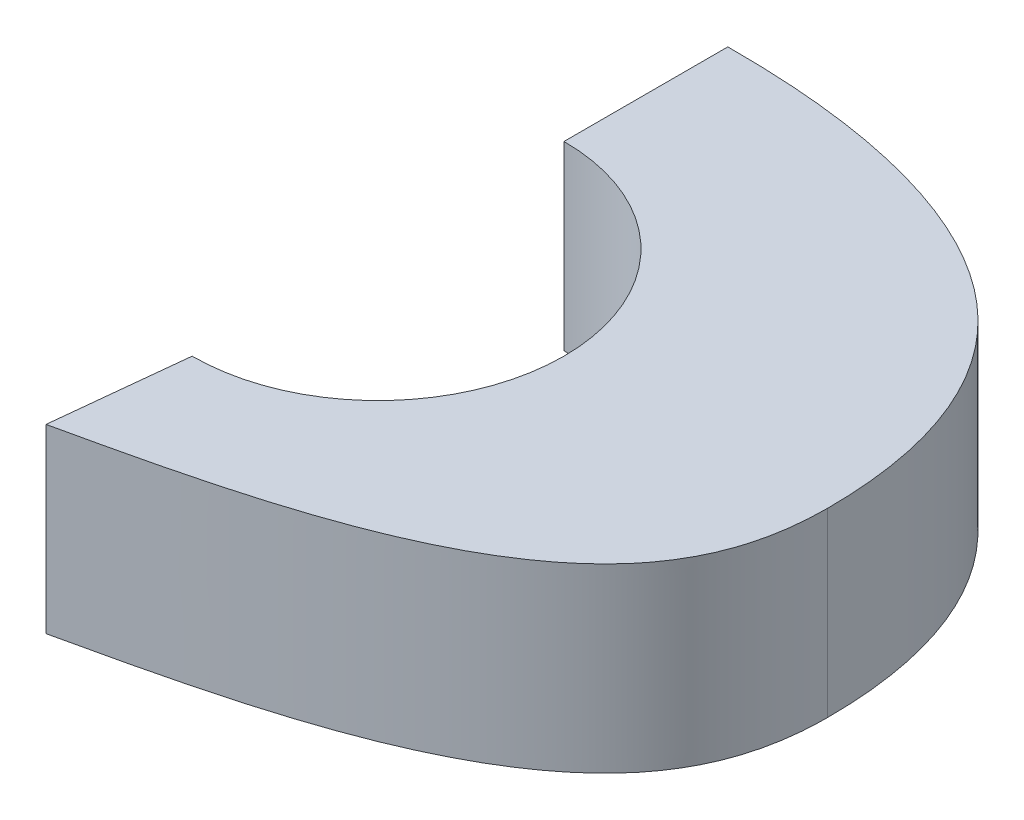
ISO-10303-21;
HEADER;
FILE_DESCRIPTION(('STEP AP214'),'2;1');
FILE_NAME('part.step','',(''),(''),'','','');
FILE_SCHEMA(('AUTOMOTIVE_DESIGN { 1 0 10303 214 1 1 1 1 }'));
ENDSEC;
DATA;
#1=APPLICATION_CONTEXT('core data for automotive mechanical design processes');
#2=APPLICATION_PROTOCOL_DEFINITION('international standard','automotive_design',2000,#1);
#3=PRODUCT_CONTEXT('',#1,'mechanical');
#4=PRODUCT('Part','Part','',(#3));
#5=PRODUCT_RELATED_PRODUCT_CATEGORY('part','',(#4));
#6=PRODUCT_DEFINITION_FORMATION('','',#4);
#7=PRODUCT_DEFINITION_CONTEXT('part definition',#1,'design');
#8=PRODUCT_DEFINITION('design','',#6,#7);
#9=PRODUCT_DEFINITION_SHAPE('','',#8);
#10=(LENGTH_UNIT() NAMED_UNIT(*) SI_UNIT(.MILLI.,.METRE.));
#11=(NAMED_UNIT(*) PLANE_ANGLE_UNIT() SI_UNIT($,.RADIAN.));
#12=(NAMED_UNIT(*) SI_UNIT($,.STERADIAN.) SOLID_ANGLE_UNIT());
#13=UNCERTAINTY_MEASURE_WITH_UNIT(LENGTH_MEASURE(1.E-05),#10,'distance_accuracy_value','');
#14=(GEOMETRIC_REPRESENTATION_CONTEXT(3) GLOBAL_UNCERTAINTY_ASSIGNED_CONTEXT((#13)) GLOBAL_UNIT_ASSIGNED_CONTEXT((#10,
#11,#12)) REPRESENTATION_CONTEXT('',''));
#15=CARTESIAN_POINT('',(0.,0.,0.));
#16=DIRECTION('',(0.,0.,1.));
#17=DIRECTION('',(1.,0.,0.));
#18=AXIS2_PLACEMENT_3D('',#15,#16,#17);
#19=CARTESIAN_POINT('',(-54.0363656247546,0.,-30.75));
#20=DIRECTION('',(0.,1.,0.));
#21=DIRECTION('',(0.,0.,1.));
#22=AXIS2_PLACEMENT_3D('',#19,#20,#21);
#23=PLANE('',#22);
#24=DIRECTION('',(-0.105174760256228,0.,0.994453754482854));
#25=VECTOR('',#24,1.);
#26=CARTESIAN_POINT('',(3.69141825415091,0.,-24.6446323021882));
#27=LINE('',#26,#25);
#28=CARTESIAN_POINT('',(0.,0.,10.258653745374));
#29=VERTEX_POINT('',#28);
#30=CARTESIAN_POINT('',(-0.771119946908726,0.,17.5497863754062));
#31=VERTEX_POINT('',#30);
#32=EDGE_CURVE('E117',#29,#31,#27,.T.);
#33=ORIENTED_EDGE('',*,*,#32,.F.);
#34=CARTESIAN_POINT('',(0.,0.,0.));
#35=DIRECTION('',(0.,1.,0.));
#36=DIRECTION('',(0.,0.,1.));
#37=AXIS2_PLACEMENT_3D('',#34,#35,#36);
#38=CIRCLE('',#37,10.258653745374);
#39=CARTESIAN_POINT('',(0.,0.,-10.258653745374));
#40=VERTEX_POINT('',#39);
#41=EDGE_CURVE('E86',#40,#29,#38,.F.);
#42=ORIENTED_EDGE('',*,*,#41,.F.);
#43=DIRECTION('',(0.,0.,1.));
#44=VECTOR('',#43,1.);
#45=CARTESIAN_POINT('',(0.,0.,-30.75));
#46=LINE('',#45,#44);
#47=CARTESIAN_POINT('',(0.,0.,-19.3));
#48=VERTEX_POINT('',#47);
#49=EDGE_CURVE('E89',#48,#40,#46,.T.);
#50=ORIENTED_EDGE('',*,*,#49,.F.);
#51=CARTESIAN_POINT('',(24.8,0.,0.));
#52=CARTESIAN_POINT('',(24.8000015744337,0.,-1.49979452721091));
#53=CARTESIAN_POINT('',(24.6798675826929,0.,-2.97831562820964));
#54=CARTESIAN_POINT('',(24.2702622382681,0.,-5.15547469962744));
#55=CARTESIAN_POINT('',(24.0952050293792,0.,-5.87437295534883));
#56=CARTESIAN_POINT('',(23.7647852909253,0.,-6.94070840901966));
#57=CARTESIAN_POINT('',(23.6433054797848,0.,-7.29414550802442));
#58=CARTESIAN_POINT('',(23.3754912884338,0.,-7.99661849615101));
#59=CARTESIAN_POINT('',(23.2292080007831,0.,-8.3451272181344));
#60=CARTESIAN_POINT('',(22.7584353220897,0.,-9.36583810657752));
#61=CARTESIAN_POINT('',(22.3999317471622,0.,-10.0190317447576));
#62=CARTESIAN_POINT('',(21.5892426749382,0.,-11.2681877421538));
#63=CARTESIAN_POINT('',(21.1362438818968,0.,-11.8650387848125));
#64=CARTESIAN_POINT('',(19.6346830602268,0.,-13.5599686321418));
#65=CARTESIAN_POINT('',(18.4892029152586,0.,-14.5136863066977));
#66=CARTESIAN_POINT('',(16.9096804013256,0.,-15.5256534747403));
#67=CARTESIAN_POINT('',(16.5853525897709,0.,-15.7195004166465));
#68=CARTESIAN_POINT('',(15.9298223171448,0.,-16.0859387820694));
#69=CARTESIAN_POINT('',(15.598164332097,0.,-16.2589123530397));
#70=CARTESIAN_POINT('',(14.5925785934927,0.,-16.7499038499375));
#71=CARTESIAN_POINT('',(13.9080815118995,0.,-17.0401042985345));
#72=CARTESIAN_POINT('',(12.5152933535608,0.,-17.557881638352));
#73=CARTESIAN_POINT('',(11.80698587176,0.,-17.7854153530101));
#74=CARTESIAN_POINT('',(10.3697828105273,0.,-18.1862968457047));
#75=CARTESIAN_POINT('',(9.63866147903293,0.,-18.36002568154));
#76=CARTESIAN_POINT('',(7.43663360861958,0.,-18.8060098118951));
#77=CARTESIAN_POINT('',(5.95900169711121,0.,-19.0044890875771));
#78=CARTESIAN_POINT('',(2.98950104966866,0.,-19.255065785839));
#79=CARTESIAN_POINT('',(1.49753200090117,0.,-19.3061318001508));
#80=CARTESIAN_POINT('',(0.,0.,-19.3));
#81=B_SPLINE_CURVE_WITH_KNOTS('',3,(#51,#52,#53,#54,#55,#56,#57,#58,#59,#60,#61,#62,#63,#64,#65,
#66,#67,#68,#69,#70,#71,#72,#73,#74,#75,#76,#77,#78,#79,#80),.UNSPECIFIED.,.F.,.F.,(4,2,2,2,2,2,
2,2,2,2,2,2,2,2,4),(0.,0.124999999999999,0.187499999999999,0.218749999999999,0.249999999999999,
0.312499999999999,0.374999999999999,0.5,0.53125,0.5625,0.625,0.6875,0.75,0.875,1.),.UNSPECIFIED.);
#82=CARTESIAN_POINT('',(24.8,0.,0.));
#83=VERTEX_POINT('',#82);
#84=EDGE_CURVE('E175',#83,#48,#81,.T.);
#85=ORIENTED_EDGE('',*,*,#84,.F.);
#86=CARTESIAN_POINT('',(-0.771119946908726,0.,17.5497863754062));
#87=CARTESIAN_POINT('',(1.96332113946662,0.,16.9454486099031));
#88=CARTESIAN_POINT('',(4.6953411490743,0.,16.3335757900358));
#89=CARTESIAN_POINT('',(8.7300249024378,0.,15.2186156366684));
#90=CARTESIAN_POINT('',(10.064478194636,0.,14.8144660894164));
#91=CARTESIAN_POINT('',(12.6997298231446,0.,13.9014235495045));
#92=CARTESIAN_POINT('',(14.0007960074535,0.,13.3933641732161));
#93=CARTESIAN_POINT('',(15.9118882822926,0.,12.5052062193334));
#94=CARTESIAN_POINT('',(16.5420918653368,0.,12.1879055278116));
#95=CARTESIAN_POINT('',(17.7844021533336,0.,11.4969817009426));
#96=CARTESIAN_POINT('',(18.3919176974607,0.,11.1256625764923));
#97=CARTESIAN_POINT('',(19.5594101743914,0.,10.3246328599442));
#98=CARTESIAN_POINT('',(20.1211643421252,0.,9.89409815050034));
#99=CARTESIAN_POINT('',(20.9205386125971,0.,9.18924898015773));
#100=CARTESIAN_POINT('',(21.1806829109853,0.,8.94339318598233));
#101=CARTESIAN_POINT('',(21.6784621530258,0.,8.43466062188636));
#102=CARTESIAN_POINT('',(21.9161353542625,0.,8.17190790439401));
#103=CARTESIAN_POINT('',(22.5925909797541,0.,7.35631113149856));
#104=CARTESIAN_POINT('',(22.9947459940547,0.,6.77608102822973));
#105=CARTESIAN_POINT('',(23.5131230455677,0.,5.84229005599218));
#106=CARTESIAN_POINT('',(23.6718222440997,0.,5.51977932742099));
#107=CARTESIAN_POINT('',(23.9535662982575,0.,4.86813842037827));
#108=CARTESIAN_POINT('',(24.0776882219069,0.,4.53727326165061));
#109=CARTESIAN_POINT('',(24.402854636612,0.,3.53046253962296));
#110=CARTESIAN_POINT('',(24.5567458779073,0.,2.84031561657847));
#111=CARTESIAN_POINT('',(24.7559506331205,0.,1.42732092008006));
#112=CARTESIAN_POINT('',(24.8,0.,0.714331591055543));
#113=CARTESIAN_POINT('',(24.8,0.,0.));
#114=B_SPLINE_CURVE_WITH_KNOTS('',3,(#86,#87,#88,#89,#90,#91,#92,#93,#94,#95,#96,#97,#98,#99,
#100,#101,#102,#103,#104,#105,#106,#107,#108,#109,#110,#111,#112,#113),.UNSPECIFIED.,.F.,.F.,(4,
2,2,2,2,2,2,2,2,2,2,2,2,4),(0.,0.25,0.375,0.499999999999999,0.562499999999999,0.624999999999999,
0.687499999999999,0.718749999999999,0.749999999999999,0.812499999999999,0.843749999999999,
0.874999999999999,0.9375,1.),.UNSPECIFIED.);
#115=EDGE_CURVE('E164',#31,#83,#114,.T.);
#116=ORIENTED_EDGE('',*,*,#115,.F.);
#117=EDGE_LOOP('',(#33,#42,#50,#85,#116));
#118=FACE_BOUND('',#117,.T.);
#119=ADVANCED_FACE('F33',(#118),#23,.F.);
#120=CARTESIAN_POINT('',(-54.0363656247546,10.,-30.75));
#121=DIRECTION('',(0.,1.,0.));
#122=DIRECTION('',(0.,0.,1.));
#123=AXIS2_PLACEMENT_3D('',#120,#121,#122);
#124=PLANE('',#123);
#125=CARTESIAN_POINT('',(0.,10.,0.));
#126=DIRECTION('',(0.,-1.,0.));
#127=DIRECTION('',(0.,0.,-1.));
#128=AXIS2_PLACEMENT_3D('',#125,#126,#127);
#129=CIRCLE('',#128,10.258653745374);
#130=CARTESIAN_POINT('',(0.,10.,-10.258653745374));
#131=VERTEX_POINT('',#130);
#132=CARTESIAN_POINT('',(0.,10.,10.258653745374));
#133=VERTEX_POINT('',#132);
#134=EDGE_CURVE('E51',#131,#133,#129,.T.);
#135=ORIENTED_EDGE('',*,*,#134,.T.);
#136=DIRECTION('',(-0.105174760256228,0.,0.994453754482854));
#137=VECTOR('',#136,1.);
#138=CARTESIAN_POINT('',(0.,10.,10.258653745374));
#139=LINE('',#138,#137);
#140=CARTESIAN_POINT('',(-0.771119946908726,10.,17.5497863754062));
#141=VERTEX_POINT('',#140);
#142=EDGE_CURVE('E93',#133,#141,#139,.T.);
#143=ORIENTED_EDGE('',*,*,#142,.T.);
#144=CARTESIAN_POINT('',(24.8,10.,0.));
#145=CARTESIAN_POINT('',(24.8,10.,0.714331591055543));
#146=CARTESIAN_POINT('',(24.7559506331205,10.,1.42732092008006));
#147=CARTESIAN_POINT('',(24.5567458779073,10.,2.84031561657847));
#148=CARTESIAN_POINT('',(24.402854636612,10.,3.53046253962296));
#149=CARTESIAN_POINT('',(24.0776882219069,10.,4.53727326165061));
#150=CARTESIAN_POINT('',(23.9535662982575,10.,4.86813842037827));
#151=CARTESIAN_POINT('',(23.6718222440997,10.,5.51977932742099));
#152=CARTESIAN_POINT('',(23.5131230455677,10.,5.84229005599218));
#153=CARTESIAN_POINT('',(22.9947459940547,10.,6.77608102822973));
#154=CARTESIAN_POINT('',(22.5925909797541,10.,7.35631113149856));
#155=CARTESIAN_POINT('',(21.9161353542625,10.,8.17190790439401));
#156=CARTESIAN_POINT('',(21.6784621530258,10.,8.43466062188636));
#157=CARTESIAN_POINT('',(21.1806829109853,10.,8.94339318598233));
#158=CARTESIAN_POINT('',(20.9205386125971,10.,9.18924898015773));
#159=CARTESIAN_POINT('',(20.1211643421252,10.,9.89409815050034));
#160=CARTESIAN_POINT('',(19.5594101743914,10.,10.3246328599442));
#161=CARTESIAN_POINT('',(18.3919176974607,10.,11.1256625764923));
#162=CARTESIAN_POINT('',(17.7844021533336,10.,11.4969817009426));
#163=CARTESIAN_POINT('',(16.5420918653368,10.,12.1879055278116));
#164=CARTESIAN_POINT('',(15.9118882822926,10.,12.5052062193334));
#165=CARTESIAN_POINT('',(14.0007960074535,10.,13.3933641732161));
#166=CARTESIAN_POINT('',(12.6997298231446,10.,13.9014235495045));
#167=CARTESIAN_POINT('',(10.064478194636,10.,14.8144660894164));
#168=CARTESIAN_POINT('',(8.7300249024378,10.,15.2186156366684));
#169=CARTESIAN_POINT('',(4.6953411490743,10.,16.3335757900358));
#170=CARTESIAN_POINT('',(1.96332113946662,10.,16.9454486099031));
#171=CARTESIAN_POINT('',(-0.771119946908726,10.,17.5497863754062));
#172=B_SPLINE_CURVE_WITH_KNOTS('',3,(#144,#145,#146,#147,#148,#149,#150,#151,#152,#153,#154,
#155,#156,#157,#158,#159,#160,#161,#162,#163,#164,#165,#166,#167,#168,#169,#170,#171),
.UNSPECIFIED.,.F.,.F.,(4,2,2,2,2,2,2,2,2,2,2,2,2,4),(0.,0.0625000000000003,0.125000000000001,
0.156250000000001,0.187500000000001,0.250000000000001,0.281250000000001,0.312500000000001,
0.375000000000001,0.437500000000001,0.500000000000001,0.625,0.75,1.),.UNSPECIFIED.);
#173=CARTESIAN_POINT('',(24.8,10.,0.));
#174=VERTEX_POINT('',#173);
#175=EDGE_CURVE('E119',#141,#174,#172,.F.);
#176=ORIENTED_EDGE('',*,*,#175,.T.);
#177=CARTESIAN_POINT('',(0.,10.,-19.3));
#178=CARTESIAN_POINT('',(1.49753200090117,10.,-19.3061318001508));
#179=CARTESIAN_POINT('',(2.98950104966866,10.,-19.255065785839));
#180=CARTESIAN_POINT('',(5.95900169711121,10.,-19.0044890875771));
#181=CARTESIAN_POINT('',(7.43663360861958,10.,-18.8060098118951));
#182=CARTESIAN_POINT('',(9.63866147903293,10.,-18.36002568154));
#183=CARTESIAN_POINT('',(10.3697828105273,10.,-18.1862968457047));
#184=CARTESIAN_POINT('',(11.80698587176,10.,-17.7854153530101));
#185=CARTESIAN_POINT('',(12.5152933535608,10.,-17.557881638352));
#186=CARTESIAN_POINT('',(13.9080815118995,10.,-17.0401042985345));
#187=CARTESIAN_POINT('',(14.5925785934927,10.,-16.7499038499375));
#188=CARTESIAN_POINT('',(15.598164332097,10.,-16.2589123530397));
#189=CARTESIAN_POINT('',(15.9298223171448,10.,-16.0859387820694));
#190=CARTESIAN_POINT('',(16.5853525897709,10.,-15.7195004166465));
#191=CARTESIAN_POINT('',(16.9096804013256,10.,-15.5256534747403));
#192=CARTESIAN_POINT('',(18.4892029152586,10.,-14.5136863066977));
#193=CARTESIAN_POINT('',(19.6346830602268,10.,-13.5599686321418));
#194=CARTESIAN_POINT('',(21.1362438818968,10.,-11.8650387848125));
#195=CARTESIAN_POINT('',(21.5892426749382,10.,-11.2681877421538));
#196=CARTESIAN_POINT('',(22.3999317471622,10.,-10.0190317447576));
#197=CARTESIAN_POINT('',(22.7584353220897,10.,-9.36583810657752));
#198=CARTESIAN_POINT('',(23.2292080007831,10.,-8.3451272181344));
#199=CARTESIAN_POINT('',(23.3754912884338,10.,-7.99661849615101));
#200=CARTESIAN_POINT('',(23.6433054797848,10.,-7.29414550802442));
#201=CARTESIAN_POINT('',(23.7647852909253,10.,-6.94070840901966));
#202=CARTESIAN_POINT('',(24.0952050293792,10.,-5.87437295534883));
#203=CARTESIAN_POINT('',(24.2702622382681,10.,-5.15547469962744));
#204=CARTESIAN_POINT('',(24.6798675826929,10.,-2.97831562820964));
#205=CARTESIAN_POINT('',(24.8000015744337,10.,-1.49979452721091));
#206=CARTESIAN_POINT('',(24.8,10.,0.));
#207=B_SPLINE_CURVE_WITH_KNOTS('',3,(#177,#178,#179,#180,#181,#182,#183,#184,#185,#186,#187,
#188,#189,#190,#191,#192,#193,#194,#195,#196,#197,#198,#199,#200,#201,#202,#203,#204,#205,#206),
.UNSPECIFIED.,.F.,.F.,(4,2,2,2,2,2,2,2,2,2,2,2,2,2,4),(0.,0.125,0.25,0.3125,0.375,0.4375,
0.46875,0.5,0.625000000000001,0.687500000000001,0.750000000000001,0.781250000000001,
0.812500000000001,0.875000000000001,1.),.UNSPECIFIED.);
#208=CARTESIAN_POINT('',(0.,10.,-19.3));
#209=VERTEX_POINT('',#208);
#210=EDGE_CURVE('E192',#174,#209,#207,.F.);
#211=ORIENTED_EDGE('',*,*,#210,.T.);
#212=DIRECTION('',(0.,0.,1.));
#213=VECTOR('',#212,1.);
#214=CARTESIAN_POINT('',(0.,10.,-19.3));
#215=LINE('',#214,#213);
#216=EDGE_CURVE('E104',#209,#131,#215,.T.);
#217=ORIENTED_EDGE('',*,*,#216,.T.);
#218=EDGE_LOOP('',(#135,#143,#176,#211,#217));
#219=FACE_BOUND('',#218,.T.);
#220=ADVANCED_FACE('F102',(#219),#124,.T.);
#221=CARTESIAN_POINT('',(24.8,0.,0.));
#222=CARTESIAN_POINT('',(24.8000015744337,0.,-1.49979452721091));
#223=CARTESIAN_POINT('',(24.6798675826929,0.,-2.97831562820964));
#224=CARTESIAN_POINT('',(24.2702622382681,0.,-5.15547469962744));
#225=CARTESIAN_POINT('',(24.0952050293792,0.,-5.87437295534883));
#226=CARTESIAN_POINT('',(23.7647852909253,0.,-6.94070840901966));
#227=CARTESIAN_POINT('',(23.6433054797848,0.,-7.29414550802442));
#228=CARTESIAN_POINT('',(23.3754912884338,0.,-7.99661849615101));
#229=CARTESIAN_POINT('',(23.2292080007831,0.,-8.3451272181344));
#230=CARTESIAN_POINT('',(22.7584353220897,0.,-9.36583810657752));
#231=CARTESIAN_POINT('',(22.3999317471622,0.,-10.0190317447576));
#232=CARTESIAN_POINT('',(21.5892426749382,0.,-11.2681877421538));
#233=CARTESIAN_POINT('',(21.1362438818968,0.,-11.8650387848125));
#234=CARTESIAN_POINT('',(19.6346830602268,0.,-13.5599686321418));
#235=CARTESIAN_POINT('',(18.4892029152586,0.,-14.5136863066977));
#236=CARTESIAN_POINT('',(16.9096804013256,0.,-15.5256534747403));
#237=CARTESIAN_POINT('',(16.5853525897709,0.,-15.7195004166465));
#238=CARTESIAN_POINT('',(15.9298223171448,0.,-16.0859387820694));
#239=CARTESIAN_POINT('',(15.598164332097,0.,-16.2589123530397));
#240=CARTESIAN_POINT('',(14.5925785934927,0.,-16.7499038499375));
#241=CARTESIAN_POINT('',(13.9080815118995,0.,-17.0401042985345));
#242=CARTESIAN_POINT('',(12.5152933535608,0.,-17.557881638352));
#243=CARTESIAN_POINT('',(11.80698587176,0.,-17.7854153530101));
#244=CARTESIAN_POINT('',(10.3697828105273,0.,-18.1862968457047));
#245=CARTESIAN_POINT('',(9.63866147903293,0.,-18.36002568154));
#246=CARTESIAN_POINT('',(7.43663360861958,0.,-18.8060098118951));
#247=CARTESIAN_POINT('',(5.95900169711121,0.,-19.0044890875771));
#248=CARTESIAN_POINT('',(2.98950104966866,0.,-19.255065785839));
#249=CARTESIAN_POINT('',(1.49753200090117,0.,-19.3061318001508));
#250=CARTESIAN_POINT('',(0.,0.,-19.3));
#251=B_SPLINE_CURVE_WITH_KNOTS('',3,(#221,#222,#223,#224,#225,#226,#227,#228,#229,#230,#231,
#232,#233,#234,#235,#236,#237,#238,#239,#240,#241,#242,#243,#244,#245,#246,#247,#248,#249,#250),
.UNSPECIFIED.,.F.,.F.,(4,2,2,2,2,2,2,2,2,2,2,2,2,2,4),(0.,0.124999999999999,0.187499999999999,
0.218749999999999,0.249999999999999,0.312499999999999,0.374999999999999,0.5,0.53125,0.5625,
0.625,0.6875,0.75,0.875,1.),.UNSPECIFIED.);
#252=DIRECTION('',(0.,1.,0.));
#253=VECTOR('',#252,1.);
#254=SURFACE_OF_LINEAR_EXTRUSION('',#251,#253);
#255=ORIENTED_EDGE('',*,*,#210,.F.);
#256=DIRECTION('',(0.,1.,0.));
#257=VECTOR('',#256,1.);
#258=CARTESIAN_POINT('',(24.8,0.,0.));
#259=LINE('',#258,#257);
#260=EDGE_CURVE('E43',#83,#174,#259,.T.);
#261=ORIENTED_EDGE('',*,*,#260,.F.);
#262=ORIENTED_EDGE('',*,*,#84,.T.);
#263=DIRECTION('',(0.,1.,0.));
#264=VECTOR('',#263,1.);
#265=CARTESIAN_POINT('',(0.,0.,-19.3));
#266=LINE('',#265,#264);
#267=EDGE_CURVE('E11',#48,#209,#266,.T.);
#268=ORIENTED_EDGE('',*,*,#267,.T.);
#269=EDGE_LOOP('',(#255,#261,#262,#268));
#270=FACE_BOUND('',#269,.T.);
#271=ADVANCED_FACE('F138',(#270),#254,.T.);
#272=CARTESIAN_POINT('',(-0.771119946908726,0.,17.5497863754062));
#273=CARTESIAN_POINT('',(1.96332113946662,0.,16.9454486099031));
#274=CARTESIAN_POINT('',(4.6953411490743,0.,16.3335757900358));
#275=CARTESIAN_POINT('',(8.7300249024378,0.,15.2186156366684));
#276=CARTESIAN_POINT('',(10.064478194636,0.,14.8144660894164));
#277=CARTESIAN_POINT('',(12.6997298231446,0.,13.9014235495045));
#278=CARTESIAN_POINT('',(14.0007960074535,0.,13.3933641732161));
#279=CARTESIAN_POINT('',(15.9118882822926,0.,12.5052062193334));
#280=CARTESIAN_POINT('',(16.5420918653368,0.,12.1879055278116));
#281=CARTESIAN_POINT('',(17.7844021533336,0.,11.4969817009426));
#282=CARTESIAN_POINT('',(18.3919176974607,0.,11.1256625764923));
#283=CARTESIAN_POINT('',(19.5594101743914,0.,10.3246328599442));
#284=CARTESIAN_POINT('',(20.1211643421252,0.,9.89409815050034));
#285=CARTESIAN_POINT('',(20.9205386125971,0.,9.18924898015773));
#286=CARTESIAN_POINT('',(21.1806829109853,0.,8.94339318598233));
#287=CARTESIAN_POINT('',(21.6784621530258,0.,8.43466062188636));
#288=CARTESIAN_POINT('',(21.9161353542625,0.,8.17190790439401));
#289=CARTESIAN_POINT('',(22.5925909797541,0.,7.35631113149856));
#290=CARTESIAN_POINT('',(22.9947459940547,0.,6.77608102822973));
#291=CARTESIAN_POINT('',(23.5131230455677,0.,5.84229005599218));
#292=CARTESIAN_POINT('',(23.6718222440997,0.,5.51977932742099));
#293=CARTESIAN_POINT('',(23.9535662982575,0.,4.86813842037827));
#294=CARTESIAN_POINT('',(24.0776882219069,0.,4.53727326165061));
#295=CARTESIAN_POINT('',(24.402854636612,0.,3.53046253962296));
#296=CARTESIAN_POINT('',(24.5567458779073,0.,2.84031561657847));
#297=CARTESIAN_POINT('',(24.7559506331205,0.,1.42732092008006));
#298=CARTESIAN_POINT('',(24.8,0.,0.714331591055543));
#299=CARTESIAN_POINT('',(24.8,0.,0.));
#300=B_SPLINE_CURVE_WITH_KNOTS('',3,(#272,#273,#274,#275,#276,#277,#278,#279,#280,#281,#282,
#283,#284,#285,#286,#287,#288,#289,#290,#291,#292,#293,#294,#295,#296,#297,#298,#299),
.UNSPECIFIED.,.F.,.F.,(4,2,2,2,2,2,2,2,2,2,2,2,2,4),(0.,0.25,0.375,0.499999999999999,
0.562499999999999,0.624999999999999,0.687499999999999,0.718749999999999,0.749999999999999,
0.812499999999999,0.843749999999999,0.874999999999999,0.9375,1.),.UNSPECIFIED.);
#301=DIRECTION('',(0.,1.,0.));
#302=VECTOR('',#301,1.);
#303=SURFACE_OF_LINEAR_EXTRUSION('',#300,#302);
#304=ORIENTED_EDGE('',*,*,#175,.F.);
#305=DIRECTION('',(0.,1.,0.));
#306=VECTOR('',#305,1.);
#307=CARTESIAN_POINT('',(-0.771119946908726,0.,17.5497863754062));
#308=LINE('',#307,#306);
#309=EDGE_CURVE('E96',#31,#141,#308,.T.);
#310=ORIENTED_EDGE('',*,*,#309,.F.);
#311=ORIENTED_EDGE('',*,*,#115,.T.);
#312=ORIENTED_EDGE('',*,*,#260,.T.);
#313=EDGE_LOOP('',(#304,#310,#311,#312));
#314=FACE_BOUND('',#313,.T.);
#315=ADVANCED_FACE('F134',(#314),#303,.T.);
#316=CARTESIAN_POINT('',(0.,-0.25,10.258653745374));
#317=DIRECTION('',(-0.994453754482854,0.,-0.105174760256228));
#318=DIRECTION('',(-0.105174760256228,0.,0.994453754482854));
#319=AXIS2_PLACEMENT_3D('',#316,#317,#318);
#320=PLANE('',#319);
#321=ORIENTED_EDGE('',*,*,#32,.T.);
#322=ORIENTED_EDGE('',*,*,#309,.T.);
#323=ORIENTED_EDGE('',*,*,#142,.F.);
#324=DIRECTION('',(0.,1.,0.));
#325=VECTOR('',#324,1.);
#326=CARTESIAN_POINT('',(0.,-0.25,10.258653745374));
#327=LINE('',#326,#325);
#328=EDGE_CURVE('E82',#29,#133,#327,.T.);
#329=ORIENTED_EDGE('',*,*,#328,.F.);
#330=EDGE_LOOP('',(#321,#322,#323,#329));
#331=FACE_BOUND('',#330,.T.);
#332=ADVANCED_FACE('F94',(#331),#320,.T.);
#333=CARTESIAN_POINT('',(0.,-0.25,0.));
#334=DIRECTION('',(0.,1.,0.));
#335=DIRECTION('',(0.,0.,1.));
#336=AXIS2_PLACEMENT_3D('',#333,#334,#335);
#337=CYLINDRICAL_SURFACE('',#336,10.258653745374);
#338=ORIENTED_EDGE('',*,*,#41,.T.);
#339=ORIENTED_EDGE('',*,*,#328,.T.);
#340=ORIENTED_EDGE('',*,*,#134,.F.);
#341=DIRECTION('',(0.,1.,0.));
#342=VECTOR('',#341,1.);
#343=CARTESIAN_POINT('',(0.,-0.25,-10.258653745374));
#344=LINE('',#343,#342);
#345=EDGE_CURVE('E90',#40,#131,#344,.T.);
#346=ORIENTED_EDGE('',*,*,#345,.F.);
#347=EDGE_LOOP('',(#338,#339,#340,#346));
#348=FACE_BOUND('',#347,.T.);
#349=ADVANCED_FACE('F84',(#348),#337,.F.);
#350=CARTESIAN_POINT('',(0.,-0.25,-19.3));
#351=DIRECTION('',(-1.,0.,0.));
#352=DIRECTION('',(0.,0.,1.));
#353=AXIS2_PLACEMENT_3D('',#350,#351,#352);
#354=PLANE('',#353);
#355=ORIENTED_EDGE('',*,*,#49,.T.);
#356=ORIENTED_EDGE('',*,*,#345,.T.);
#357=ORIENTED_EDGE('',*,*,#216,.F.);
#358=ORIENTED_EDGE('',*,*,#267,.F.);
#359=EDGE_LOOP('',(#355,#356,#357,#358));
#360=FACE_BOUND('',#359,.T.);
#361=ADVANCED_FACE('F217',(#360),#354,.T.);
#362=CLOSED_SHELL('',(#119,#220,#271,#315,#332,#349,#361));
#363=MANIFOLD_SOLID_BREP('B2',#362);
#364=ADVANCED_BREP_SHAPE_REPRESENTATION('',(#18,#363),#14);
#365=SHAPE_DEFINITION_REPRESENTATION(#9,#364);
ENDSEC;
END-ISO-10303-21;
